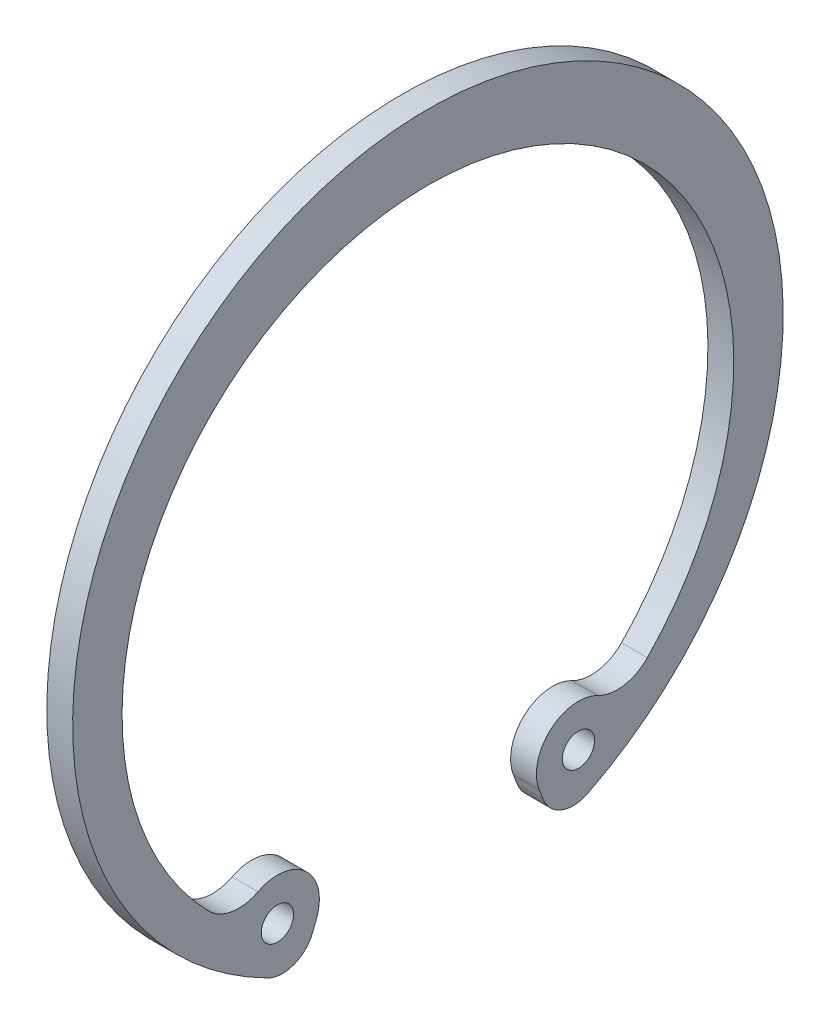
ISO-10303-21;
HEADER;
FILE_DESCRIPTION(('STEP AP214'),'2;1');
FILE_NAME('part.step','',(''),(''),'','','');
FILE_SCHEMA(('AUTOMOTIVE_DESIGN { 1 0 10303 214 1 1 1 1 }'));
ENDSEC;
DATA;
#1=APPLICATION_CONTEXT('core data for automotive mechanical design processes');
#2=APPLICATION_PROTOCOL_DEFINITION('international standard','automotive_design',2000,#1);
#3=PRODUCT_CONTEXT('',#1,'mechanical');
#4=PRODUCT('Part','Part','',(#3));
#5=PRODUCT_RELATED_PRODUCT_CATEGORY('part','',(#4));
#6=PRODUCT_DEFINITION_FORMATION('','',#4);
#7=PRODUCT_DEFINITION_CONTEXT('part definition',#1,'design');
#8=PRODUCT_DEFINITION('design','',#6,#7);
#9=PRODUCT_DEFINITION_SHAPE('','',#8);
#10=(LENGTH_UNIT() NAMED_UNIT(*) SI_UNIT(.MILLI.,.METRE.));
#11=(NAMED_UNIT(*) PLANE_ANGLE_UNIT() SI_UNIT($,.RADIAN.));
#12=(NAMED_UNIT(*) SI_UNIT($,.STERADIAN.) SOLID_ANGLE_UNIT());
#13=UNCERTAINTY_MEASURE_WITH_UNIT(LENGTH_MEASURE(1.E-05),#10,'distance_accuracy_value','');
#14=(GEOMETRIC_REPRESENTATION_CONTEXT(3) GLOBAL_UNCERTAINTY_ASSIGNED_CONTEXT((#13)) GLOBAL_UNIT_ASSIGNED_CONTEXT((#10,
#11,#12)) REPRESENTATION_CONTEXT('',''));
#15=CARTESIAN_POINT('',(0.,0.,0.));
#16=DIRECTION('',(0.,0.,1.));
#17=DIRECTION('',(1.,0.,0.));
#18=AXIS2_PLACEMENT_3D('',#15,#16,#17);
#19=CARTESIAN_POINT('',(1.,-22.3245682981852,-11.2522731170031));
#20=DIRECTION('',(1.,0.,0.));
#21=DIRECTION('',(0.,0.,-1.));
#22=AXIS2_PLACEMENT_3D('',#19,#20,#21);
#23=PLANE('',#22);
#24=CARTESIAN_POINT('',(1.,-21.2682862497192,-11.6499999999997));
#25=DIRECTION('',(1.,0.,0.));
#26=DIRECTION('',(0.,0.,-1.));
#27=AXIS2_PLACEMENT_3D('',#24,#25,#26);
#28=CIRCLE('',#27,1.25000000000028);
#29=CARTESIAN_POINT('',(1.,-21.2682862497192,-12.9));
#30=VERTEX_POINT('',#29);
#31=EDGE_CURVE('E167',#30,#30,#28,.T.);
#32=ORIENTED_EDGE('',*,*,#31,.F.);
#33=EDGE_LOOP('',(#32));
#34=FACE_BOUND('',#33,.T.);
#35=CARTESIAN_POINT('',(1.,-22.3245682981852,-11.2522731170031));
#36=DIRECTION('',(1.,0.,0.));
#37=DIRECTION('',(0.,0.,-1.));
#38=AXIS2_PLACEMENT_3D('',#35,#36,#37);
#39=CIRCLE('',#38,2.50000000000018);
#40=CARTESIAN_POINT('',(1.,-23.220909654235,-8.9184838862807));
#41=VERTEX_POINT('',#40);
#42=CARTESIAN_POINT('',(1.,-24.557025041073,-12.377500601175));
#43=VERTEX_POINT('',#42);
#44=EDGE_CURVE('E166',#41,#43,#39,.T.);
#45=ORIENTED_EDGE('',*,*,#44,.T.);
#46=CARTESIAN_POINT('',(1.,0.,7.61543605953818E-13));
#47=DIRECTION('',(1.,0.,0.));
#48=DIRECTION('',(0.,0.,-1.));
#49=AXIS2_PLACEMENT_3D('',#46,#47,#48);
#50=CIRCLE('',#49,27.4999999999999);
#51=CARTESIAN_POINT('',(1.,-24.557025128005,12.377500428703));
#52=VERTEX_POINT('',#51);
#53=EDGE_CURVE('E116',#43,#52,#50,.T.);
#54=ORIENTED_EDGE('',*,*,#53,.T.);
#55=CARTESIAN_POINT('',(1.,-22.3245682981844,11.2522731170039));
#56=DIRECTION('',(1.,0.,0.));
#57=DIRECTION('',(0.,0.,-1.));
#58=AXIS2_PLACEMENT_3D('',#55,#56,#57);
#59=CIRCLE('',#58,2.50000000000122);
#60=CARTESIAN_POINT('',(1.,-23.220909654235,8.9184838862807));
#61=VERTEX_POINT('',#60);
#62=EDGE_CURVE('E175',#52,#61,#59,.T.);
#63=ORIENTED_EDGE('',*,*,#62,.T.);
#64=DIRECTION('',(0.,0.933515692288985,-0.358536542419622));
#65=VECTOR('',#64,1.);
#66=CARTESIAN_POINT('',(1.,-23.220909654235,8.9184838862807));
#67=LINE('',#66,#65);
#68=CARTESIAN_POINT('',(1.,-22.433530012583,8.6160740000609));
#69=VERTEX_POINT('',#68);
#70=EDGE_CURVE('E171',#61,#69,#67,.T.);
#71=ORIENTED_EDGE('',*,*,#70,.T.);
#72=CARTESIAN_POINT('',(1.,-21.2682862497192,11.6499999999997));
#73=DIRECTION('',(1.,0.,0.));
#74=DIRECTION('',(0.,0.,-1.));
#75=AXIS2_PLACEMENT_3D('',#72,#73,#74);
#76=CIRCLE('',#75,3.24999999999966);
#77=CARTESIAN_POINT('',(1.,-18.386033390351,13.151705182338));
#78=VERTEX_POINT('',#77);
#79=EDGE_CURVE('E177',#69,#78,#76,.T.);
#80=ORIENTED_EDGE('',*,*,#79,.T.);
#81=CARTESIAN_POINT('',(1.,-15.503780463521,14.6534102351958));
#82=DIRECTION('',(-1.,0.,0.));
#83=DIRECTION('',(0.,0.,1.));
#84=AXIS2_PLACEMENT_3D('',#81,#82,#83);
#85=CIRCLE('',#84,3.24999999999979);
#86=CARTESIAN_POINT('',(1.,-17.767845941114,16.985042177242));
#87=VERTEX_POINT('',#86);
#88=EDGE_CURVE('E179',#78,#87,#85,.T.);
#89=ORIENTED_EDGE('',*,*,#88,.T.);
#90=CARTESIAN_POINT('',(1.,-1.27500000000011,0.));
#91=DIRECTION('',(-1.,0.,0.));
#92=DIRECTION('',(0.,0.,1.));
#93=AXIS2_PLACEMENT_3D('',#90,#91,#92);
#94=CIRCLE('',#93,23.6750000000001);
#95=CARTESIAN_POINT('',(1.,-17.767845656455,-16.985042453652));
#96=VERTEX_POINT('',#95);
#97=EDGE_CURVE('E178',#87,#96,#94,.T.);
#98=ORIENTED_EDGE('',*,*,#97,.T.);
#99=CARTESIAN_POINT('',(1.,-15.5037804635211,-14.6534102351958));
#100=DIRECTION('',(-1.,0.,0.));
#101=DIRECTION('',(0.,0.,1.));
#102=AXIS2_PLACEMENT_3D('',#99,#100,#101);
#103=CIRCLE('',#102,3.24999999999967);
#104=CARTESIAN_POINT('',(1.,-18.386033390351,-13.151705182338));
#105=VERTEX_POINT('',#104);
#106=EDGE_CURVE('E185',#96,#105,#103,.T.);
#107=ORIENTED_EDGE('',*,*,#106,.T.);
#108=CARTESIAN_POINT('',(1.,-21.2682862497192,-11.6499999999997));
#109=DIRECTION('',(1.,0.,0.));
#110=DIRECTION('',(0.,0.,-1.));
#111=AXIS2_PLACEMENT_3D('',#108,#109,#110);
#112=CIRCLE('',#111,3.24999999999966);
#113=CARTESIAN_POINT('',(1.,-22.433530012583,-8.6160740000609));
#114=VERTEX_POINT('',#113);
#115=EDGE_CURVE('E56',#105,#114,#112,.T.);
#116=ORIENTED_EDGE('',*,*,#115,.T.);
#117=DIRECTION('',(0.,-0.933515692288985,-0.358536542419622));
#118=VECTOR('',#117,1.);
#119=CARTESIAN_POINT('',(1.,-22.433530012583,-8.6160740000609));
#120=LINE('',#119,#118);
#121=EDGE_CURVE('E53',#114,#41,#120,.T.);
#122=ORIENTED_EDGE('',*,*,#121,.T.);
#123=EDGE_LOOP('',(#45,#54,#63,#71,#80,#89,#98,#107,#116,#122));
#124=FACE_BOUND('',#123,.T.);
#125=CARTESIAN_POINT('',(1.,-21.2682862497192,11.6499999999997));
#126=DIRECTION('',(1.,0.,0.));
#127=DIRECTION('',(0.,0.,-1.));
#128=AXIS2_PLACEMENT_3D('',#125,#126,#127);
#129=CIRCLE('',#128,1.24999999999972);
#130=CARTESIAN_POINT('',(1.,-21.2682862497192,10.4));
#131=VERTEX_POINT('',#130);
#132=EDGE_CURVE('E162',#131,#131,#129,.T.);
#133=ORIENTED_EDGE('',*,*,#132,.F.);
#134=EDGE_LOOP('',(#133));
#135=FACE_BOUND('',#134,.T.);
#136=ADVANCED_FACE('F39',(#34,#124,#135),#23,.T.);
#137=CARTESIAN_POINT('',(1.,-22.3245682981852,-11.2522731170031));
#138=DIRECTION('',(-1.,0.,0.));
#139=DIRECTION('',(0.,0.,1.));
#140=AXIS2_PLACEMENT_3D('',#137,#138,#139);
#141=CYLINDRICAL_SURFACE('',#140,2.50000000000018);
#142=DIRECTION('',(-1.,0.,0.));
#143=VECTOR('',#142,1.);
#144=CARTESIAN_POINT('',(1.,-23.220909654235,-8.9184838862807));
#145=LINE('',#144,#143);
#146=CARTESIAN_POINT('',(-1.,-23.220909654235,-8.9184838862807));
#147=VERTEX_POINT('',#146);
#148=EDGE_CURVE('E131',#41,#147,#145,.T.);
#149=ORIENTED_EDGE('',*,*,#148,.T.);
#150=CARTESIAN_POINT('',(-1.,-22.3245682981852,-11.2522731170031));
#151=DIRECTION('',(1.,0.,0.));
#152=DIRECTION('',(0.,0.,-1.));
#153=AXIS2_PLACEMENT_3D('',#150,#151,#152);
#154=CIRCLE('',#153,2.50000000000018);
#155=CARTESIAN_POINT('',(-1.,-24.557025041073,-12.377500601175));
#156=VERTEX_POINT('',#155);
#157=EDGE_CURVE('E126',#147,#156,#154,.T.);
#158=ORIENTED_EDGE('',*,*,#157,.T.);
#159=DIRECTION('',(-1.,0.,0.));
#160=VECTOR('',#159,1.);
#161=CARTESIAN_POINT('',(1.,-24.557025041073,-12.377500601175));
#162=LINE('',#161,#160);
#163=EDGE_CURVE('E11',#43,#156,#162,.T.);
#164=ORIENTED_EDGE('',*,*,#163,.F.);
#165=ORIENTED_EDGE('',*,*,#44,.F.);
#166=EDGE_LOOP('',(#149,#158,#164,#165));
#167=FACE_BOUND('',#166,.T.);
#168=ADVANCED_FACE('F41',(#167),#141,.T.);
#169=CARTESIAN_POINT('',(1.,0.,7.61543605953818E-13));
#170=DIRECTION('',(-1.,0.,0.));
#171=DIRECTION('',(0.,0.,1.));
#172=AXIS2_PLACEMENT_3D('',#169,#170,#171);
#173=CYLINDRICAL_SURFACE('',#172,27.4999999999999);
#174=ORIENTED_EDGE('',*,*,#163,.T.);
#175=CARTESIAN_POINT('',(-1.,0.,7.61543605953818E-13));
#176=DIRECTION('',(1.,0.,0.));
#177=DIRECTION('',(0.,0.,-1.));
#178=AXIS2_PLACEMENT_3D('',#175,#176,#177);
#179=CIRCLE('',#178,27.4999999999999);
#180=CARTESIAN_POINT('',(-1.,-24.557025128005,12.377500428703));
#181=VERTEX_POINT('',#180);
#182=EDGE_CURVE('E119',#156,#181,#179,.T.);
#183=ORIENTED_EDGE('',*,*,#182,.T.);
#184=DIRECTION('',(-1.,0.,0.));
#185=VECTOR('',#184,1.);
#186=CARTESIAN_POINT('',(1.,-24.557025128005,12.377500428703));
#187=LINE('',#186,#185);
#188=EDGE_CURVE('E50',#52,#181,#187,.T.);
#189=ORIENTED_EDGE('',*,*,#188,.F.);
#190=ORIENTED_EDGE('',*,*,#53,.F.);
#191=EDGE_LOOP('',(#174,#183,#189,#190));
#192=FACE_BOUND('',#191,.T.);
#193=ADVANCED_FACE('F117',(#192),#173,.T.);
#194=CARTESIAN_POINT('',(1.,-22.3245682981844,11.2522731170039));
#195=DIRECTION('',(-1.,0.,0.));
#196=DIRECTION('',(0.,0.,1.));
#197=AXIS2_PLACEMENT_3D('',#194,#195,#196);
#198=CYLINDRICAL_SURFACE('',#197,2.50000000000122);
#199=ORIENTED_EDGE('',*,*,#188,.T.);
#200=CARTESIAN_POINT('',(-1.,-22.3245682981844,11.2522731170039));
#201=DIRECTION('',(1.,0.,0.));
#202=DIRECTION('',(0.,0.,-1.));
#203=AXIS2_PLACEMENT_3D('',#200,#201,#202);
#204=CIRCLE('',#203,2.50000000000122);
#205=CARTESIAN_POINT('',(-1.,-23.220909654235,8.9184838862807));
#206=VERTEX_POINT('',#205);
#207=EDGE_CURVE('E135',#181,#206,#204,.T.);
#208=ORIENTED_EDGE('',*,*,#207,.T.);
#209=DIRECTION('',(-1.,0.,0.));
#210=VECTOR('',#209,1.);
#211=CARTESIAN_POINT('',(1.,-23.220909654235,8.9184838862807));
#212=LINE('',#211,#210);
#213=EDGE_CURVE('E200',#61,#206,#212,.T.);
#214=ORIENTED_EDGE('',*,*,#213,.F.);
#215=ORIENTED_EDGE('',*,*,#62,.F.);
#216=EDGE_LOOP('',(#199,#208,#214,#215));
#217=FACE_BOUND('',#216,.T.);
#218=ADVANCED_FACE('F205',(#217),#198,.T.);
#219=CARTESIAN_POINT('',(1.,-23.220909654235,8.9184838862807));
#220=DIRECTION('',(0.,0.358536542419622,0.933515692288985));
#221=DIRECTION('',(0.,-0.933515692288985,0.358536542419622));
#222=AXIS2_PLACEMENT_3D('',#219,#220,#221);
#223=PLANE('',#222);
#224=ORIENTED_EDGE('',*,*,#213,.T.);
#225=DIRECTION('',(0.,0.933515692288985,-0.358536542419622));
#226=VECTOR('',#225,1.);
#227=CARTESIAN_POINT('',(-1.,-23.220909654235,8.9184838862807));
#228=LINE('',#227,#226);
#229=CARTESIAN_POINT('',(-1.,-22.433530012583,8.6160740000609));
#230=VERTEX_POINT('',#229);
#231=EDGE_CURVE('E141',#206,#230,#228,.T.);
#232=ORIENTED_EDGE('',*,*,#231,.T.);
#233=DIRECTION('',(-1.,0.,0.));
#234=VECTOR('',#233,1.);
#235=CARTESIAN_POINT('',(1.,-22.433530012583,8.6160740000609));
#236=LINE('',#235,#234);
#237=EDGE_CURVE('E197',#69,#230,#236,.T.);
#238=ORIENTED_EDGE('',*,*,#237,.F.);
#239=ORIENTED_EDGE('',*,*,#70,.F.);
#240=EDGE_LOOP('',(#224,#232,#238,#239));
#241=FACE_BOUND('',#240,.T.);
#242=ADVANCED_FACE('F209',(#241),#223,.F.);
#243=CARTESIAN_POINT('',(1.,-21.2682862497192,11.6499999999997));
#244=DIRECTION('',(-1.,0.,0.));
#245=DIRECTION('',(0.,0.,1.));
#246=AXIS2_PLACEMENT_3D('',#243,#244,#245);
#247=CYLINDRICAL_SURFACE('',#246,3.24999999999966);
#248=ORIENTED_EDGE('',*,*,#237,.T.);
#249=CARTESIAN_POINT('',(-1.,-21.2682862497192,11.6499999999997));
#250=DIRECTION('',(1.,0.,0.));
#251=DIRECTION('',(0.,0.,-1.));
#252=AXIS2_PLACEMENT_3D('',#249,#250,#251);
#253=CIRCLE('',#252,3.24999999999966);
#254=CARTESIAN_POINT('',(-1.,-18.386033390351,13.151705182338));
#255=VERTEX_POINT('',#254);
#256=EDGE_CURVE('E148',#230,#255,#253,.T.);
#257=ORIENTED_EDGE('',*,*,#256,.T.);
#258=DIRECTION('',(-1.,0.,0.));
#259=VECTOR('',#258,1.);
#260=CARTESIAN_POINT('',(1.,-18.386033390351,13.151705182338));
#261=LINE('',#260,#259);
#262=EDGE_CURVE('E194',#78,#255,#261,.T.);
#263=ORIENTED_EDGE('',*,*,#262,.F.);
#264=ORIENTED_EDGE('',*,*,#79,.F.);
#265=EDGE_LOOP('',(#248,#257,#263,#264));
#266=FACE_BOUND('',#265,.T.);
#267=ADVANCED_FACE('F213',(#266),#247,.T.);
#268=CARTESIAN_POINT('',(1.,-15.503780463521,14.6534102351958));
#269=DIRECTION('',(-1.,0.,0.));
#270=DIRECTION('',(0.,0.,1.));
#271=AXIS2_PLACEMENT_3D('',#268,#269,#270);
#272=CYLINDRICAL_SURFACE('',#271,3.24999999999979);
#273=ORIENTED_EDGE('',*,*,#262,.T.);
#274=CARTESIAN_POINT('',(-1.,-15.503780463521,14.6534102351958));
#275=DIRECTION('',(-1.,0.,0.));
#276=DIRECTION('',(0.,0.,1.));
#277=AXIS2_PLACEMENT_3D('',#274,#275,#276);
#278=CIRCLE('',#277,3.24999999999979);
#279=CARTESIAN_POINT('',(-1.,-17.767845941114,16.985042177242));
#280=VERTEX_POINT('',#279);
#281=EDGE_CURVE('E149',#255,#280,#278,.T.);
#282=ORIENTED_EDGE('',*,*,#281,.T.);
#283=DIRECTION('',(-1.,0.,0.));
#284=VECTOR('',#283,1.);
#285=CARTESIAN_POINT('',(1.,-17.767845941114,16.985042177242));
#286=LINE('',#285,#284);
#287=EDGE_CURVE('E193',#87,#280,#286,.T.);
#288=ORIENTED_EDGE('',*,*,#287,.F.);
#289=ORIENTED_EDGE('',*,*,#88,.F.);
#290=EDGE_LOOP('',(#273,#282,#288,#289));
#291=FACE_BOUND('',#290,.T.);
#292=ADVANCED_FACE('F217',(#291),#272,.F.);
#293=CARTESIAN_POINT('',(1.,-1.27500000000011,0.));
#294=DIRECTION('',(-1.,0.,0.));
#295=DIRECTION('',(0.,0.,1.));
#296=AXIS2_PLACEMENT_3D('',#293,#294,#295);
#297=CYLINDRICAL_SURFACE('',#296,23.6750000000001);
#298=ORIENTED_EDGE('',*,*,#287,.T.);
#299=CARTESIAN_POINT('',(-1.,-1.27500000000011,0.));
#300=DIRECTION('',(-1.,0.,0.));
#301=DIRECTION('',(0.,0.,1.));
#302=AXIS2_PLACEMENT_3D('',#299,#300,#301);
#303=CIRCLE('',#302,23.6750000000001);
#304=CARTESIAN_POINT('',(-1.,-17.767845656455,-16.985042453652));
#305=VERTEX_POINT('',#304);
#306=EDGE_CURVE('E155',#280,#305,#303,.T.);
#307=ORIENTED_EDGE('',*,*,#306,.T.);
#308=DIRECTION('',(-1.,0.,0.));
#309=VECTOR('',#308,1.);
#310=CARTESIAN_POINT('',(1.,-17.767845656455,-16.985042453652));
#311=LINE('',#310,#309);
#312=EDGE_CURVE('E191',#96,#305,#311,.T.);
#313=ORIENTED_EDGE('',*,*,#312,.F.);
#314=ORIENTED_EDGE('',*,*,#97,.F.);
#315=EDGE_LOOP('',(#298,#307,#313,#314));
#316=FACE_BOUND('',#315,.T.);
#317=ADVANCED_FACE('F221',(#316),#297,.F.);
#318=CARTESIAN_POINT('',(1.,-15.5037804635211,-14.6534102351958));
#319=DIRECTION('',(-1.,0.,0.));
#320=DIRECTION('',(0.,0.,1.));
#321=AXIS2_PLACEMENT_3D('',#318,#319,#320);
#322=CYLINDRICAL_SURFACE('',#321,3.24999999999967);
#323=ORIENTED_EDGE('',*,*,#312,.T.);
#324=CARTESIAN_POINT('',(-1.,-15.5037804635211,-14.6534102351958));
#325=DIRECTION('',(-1.,0.,0.));
#326=DIRECTION('',(0.,0.,1.));
#327=AXIS2_PLACEMENT_3D('',#324,#325,#326);
#328=CIRCLE('',#327,3.24999999999967);
#329=CARTESIAN_POINT('',(-1.,-18.386033390351,-13.151705182338));
#330=VERTEX_POINT('',#329);
#331=EDGE_CURVE('E154',#305,#330,#328,.T.);
#332=ORIENTED_EDGE('',*,*,#331,.T.);
#333=DIRECTION('',(-1.,0.,0.));
#334=VECTOR('',#333,1.);
#335=CARTESIAN_POINT('',(1.,-18.386033390351,-13.151705182338));
#336=LINE('',#335,#334);
#337=EDGE_CURVE('E186',#105,#330,#336,.T.);
#338=ORIENTED_EDGE('',*,*,#337,.F.);
#339=ORIENTED_EDGE('',*,*,#106,.F.);
#340=EDGE_LOOP('',(#323,#332,#338,#339));
#341=FACE_BOUND('',#340,.T.);
#342=ADVANCED_FACE('F229',(#341),#322,.F.);
#343=CARTESIAN_POINT('',(1.,-21.2682862497192,-11.6499999999997));
#344=DIRECTION('',(-1.,0.,0.));
#345=DIRECTION('',(0.,0.,1.));
#346=AXIS2_PLACEMENT_3D('',#343,#344,#345);
#347=CYLINDRICAL_SURFACE('',#346,3.24999999999966);
#348=ORIENTED_EDGE('',*,*,#337,.T.);
#349=CARTESIAN_POINT('',(-1.,-21.2682862497192,-11.6499999999997));
#350=DIRECTION('',(1.,0.,0.));
#351=DIRECTION('',(0.,0.,-1.));
#352=AXIS2_PLACEMENT_3D('',#349,#350,#351);
#353=CIRCLE('',#352,3.24999999999966);
#354=CARTESIAN_POINT('',(-1.,-22.433530012583,-8.6160740000609));
#355=VERTEX_POINT('',#354);
#356=EDGE_CURVE('E158',#330,#355,#353,.T.);
#357=ORIENTED_EDGE('',*,*,#356,.T.);
#358=DIRECTION('',(-1.,0.,0.));
#359=VECTOR('',#358,1.);
#360=CARTESIAN_POINT('',(1.,-22.433530012583,-8.6160740000609));
#361=LINE('',#360,#359);
#362=EDGE_CURVE('E190',#114,#355,#361,.T.);
#363=ORIENTED_EDGE('',*,*,#362,.F.);
#364=ORIENTED_EDGE('',*,*,#115,.F.);
#365=EDGE_LOOP('',(#348,#357,#363,#364));
#366=FACE_BOUND('',#365,.T.);
#367=ADVANCED_FACE('F232',(#366),#347,.T.);
#368=CARTESIAN_POINT('',(1.,-22.433530012583,-8.6160740000609));
#369=DIRECTION('',(0.,0.358536542419622,-0.933515692288985));
#370=DIRECTION('',(0.,0.933515692288985,0.358536542419622));
#371=AXIS2_PLACEMENT_3D('',#368,#369,#370);
#372=PLANE('',#371);
#373=ORIENTED_EDGE('',*,*,#362,.T.);
#374=DIRECTION('',(0.,-0.933515692288985,-0.358536542419622));
#375=VECTOR('',#374,1.);
#376=CARTESIAN_POINT('',(-1.,-22.433530012583,-8.6160740000609));
#377=LINE('',#376,#375);
#378=EDGE_CURVE('E161',#355,#147,#377,.T.);
#379=ORIENTED_EDGE('',*,*,#378,.T.);
#380=ORIENTED_EDGE('',*,*,#148,.F.);
#381=ORIENTED_EDGE('',*,*,#121,.F.);
#382=EDGE_LOOP('',(#373,#379,#380,#381));
#383=FACE_BOUND('',#382,.T.);
#384=ADVANCED_FACE('F234',(#383),#372,.F.);
#385=CARTESIAN_POINT('',(1.,-21.2682862497192,-11.6499999999997));
#386=DIRECTION('',(-1.,0.,0.));
#387=DIRECTION('',(0.,0.,1.));
#388=AXIS2_PLACEMENT_3D('',#385,#386,#387);
#389=CYLINDRICAL_SURFACE('',#388,1.25000000000028);
#390=ORIENTED_EDGE('',*,*,#31,.T.);
#391=EDGE_LOOP('',(#390));
#392=FACE_BOUND('',#391,.T.);
#393=CARTESIAN_POINT('',(-1.,-21.2682862497192,-11.6499999999997));
#394=DIRECTION('',(1.,0.,0.));
#395=DIRECTION('',(0.,0.,-1.));
#396=AXIS2_PLACEMENT_3D('',#393,#394,#395);
#397=CIRCLE('',#396,1.25000000000028);
#398=CARTESIAN_POINT('',(-1.,-21.2682862497192,-12.9));
#399=VERTEX_POINT('',#398);
#400=EDGE_CURVE('E133',#399,#399,#397,.T.);
#401=ORIENTED_EDGE('',*,*,#400,.F.);
#402=EDGE_LOOP('',(#401));
#403=FACE_BOUND('',#402,.T.);
#404=ADVANCED_FACE('F233',(#392,#403),#389,.F.);
#405=CARTESIAN_POINT('',(1.,-21.2682862497192,11.6499999999997));
#406=DIRECTION('',(-1.,0.,0.));
#407=DIRECTION('',(0.,0.,1.));
#408=AXIS2_PLACEMENT_3D('',#405,#406,#407);
#409=CYLINDRICAL_SURFACE('',#408,1.24999999999972);
#410=ORIENTED_EDGE('',*,*,#132,.T.);
#411=EDGE_LOOP('',(#410));
#412=FACE_BOUND('',#411,.T.);
#413=CARTESIAN_POINT('',(-1.,-21.2682862497192,11.6499999999997));
#414=DIRECTION('',(1.,0.,0.));
#415=DIRECTION('',(0.,0.,-1.));
#416=AXIS2_PLACEMENT_3D('',#413,#414,#415);
#417=CIRCLE('',#416,1.24999999999972);
#418=CARTESIAN_POINT('',(-1.,-21.2682862497192,10.4));
#419=VERTEX_POINT('',#418);
#420=EDGE_CURVE('E138',#419,#419,#417,.T.);
#421=ORIENTED_EDGE('',*,*,#420,.F.);
#422=EDGE_LOOP('',(#421));
#423=FACE_BOUND('',#422,.T.);
#424=ADVANCED_FACE('F242',(#412,#423),#409,.F.);
#425=CARTESIAN_POINT('',(-1.,-22.3245682981852,-11.2522731170031));
#426=DIRECTION('',(1.,0.,0.));
#427=DIRECTION('',(0.,0.,-1.));
#428=AXIS2_PLACEMENT_3D('',#425,#426,#427);
#429=PLANE('',#428);
#430=ORIENTED_EDGE('',*,*,#420,.T.);
#431=EDGE_LOOP('',(#430));
#432=FACE_BOUND('',#431,.T.);
#433=ORIENTED_EDGE('',*,*,#400,.T.);
#434=EDGE_LOOP('',(#433));
#435=FACE_BOUND('',#434,.T.);
#436=ORIENTED_EDGE('',*,*,#157,.F.);
#437=ORIENTED_EDGE('',*,*,#378,.F.);
#438=ORIENTED_EDGE('',*,*,#356,.F.);
#439=ORIENTED_EDGE('',*,*,#331,.F.);
#440=ORIENTED_EDGE('',*,*,#306,.F.);
#441=ORIENTED_EDGE('',*,*,#281,.F.);
#442=ORIENTED_EDGE('',*,*,#256,.F.);
#443=ORIENTED_EDGE('',*,*,#231,.F.);
#444=ORIENTED_EDGE('',*,*,#207,.F.);
#445=ORIENTED_EDGE('',*,*,#182,.F.);
#446=EDGE_LOOP('',(#436,#437,#438,#439,#440,#441,#442,#443,#444,#445));
#447=FACE_BOUND('',#446,.T.);
#448=ADVANCED_FACE('F127',(#432,#435,#447),#429,.F.);
#449=CLOSED_SHELL('',(#136,#168,#193,#218,#242,#267,#292,#317,#342,#367,#384,#404,#424,#448));
#450=MANIFOLD_SOLID_BREP('B2',#449);
#451=ADVANCED_BREP_SHAPE_REPRESENTATION('',(#18,#450),#14);
#452=SHAPE_DEFINITION_REPRESENTATION(#9,#451);
ENDSEC;
END-ISO-10303-21;
